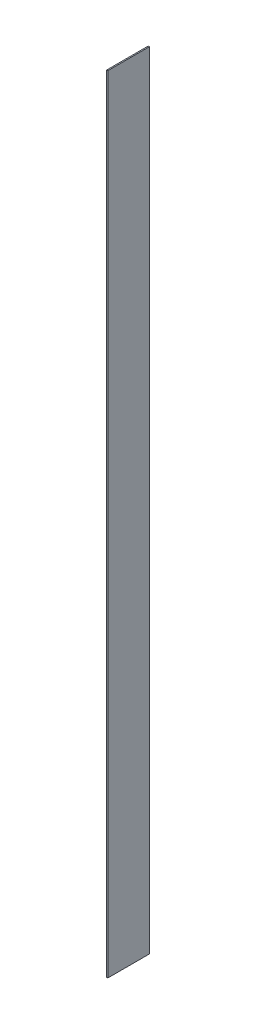
ISO-10303-21;
HEADER;
FILE_DESCRIPTION(('STEP AP214'),'2;1');
FILE_NAME('part.step','',(''),(''),'','','');
FILE_SCHEMA(('AUTOMOTIVE_DESIGN { 1 0 10303 214 1 1 1 1 }'));
ENDSEC;
DATA;
#1=APPLICATION_CONTEXT('core data for automotive mechanical design processes');
#2=APPLICATION_PROTOCOL_DEFINITION('international standard','automotive_design',2000,#1);
#3=PRODUCT_CONTEXT('',#1,'mechanical');
#4=PRODUCT('Part','Part','',(#3));
#5=PRODUCT_RELATED_PRODUCT_CATEGORY('part','',(#4));
#6=PRODUCT_DEFINITION_FORMATION('','',#4);
#7=PRODUCT_DEFINITION_CONTEXT('part definition',#1,'design');
#8=PRODUCT_DEFINITION('design','',#6,#7);
#9=PRODUCT_DEFINITION_SHAPE('','',#8);
#10=(LENGTH_UNIT() NAMED_UNIT(*) SI_UNIT(.MILLI.,.METRE.));
#11=(NAMED_UNIT(*) PLANE_ANGLE_UNIT() SI_UNIT($,.RADIAN.));
#12=(NAMED_UNIT(*) SI_UNIT($,.STERADIAN.) SOLID_ANGLE_UNIT());
#13=UNCERTAINTY_MEASURE_WITH_UNIT(LENGTH_MEASURE(1.E-05),#10,'distance_accuracy_value','');
#14=(GEOMETRIC_REPRESENTATION_CONTEXT(3) GLOBAL_UNCERTAINTY_ASSIGNED_CONTEXT((#13)) GLOBAL_UNIT_ASSIGNED_CONTEXT((#10,
#11,#12)) REPRESENTATION_CONTEXT('',''));
#15=CARTESIAN_POINT('',(0.,0.,0.));
#16=DIRECTION('',(0.,0.,1.));
#17=DIRECTION('',(1.,0.,0.));
#18=AXIS2_PLACEMENT_3D('',#15,#16,#17);
#19=CARTESIAN_POINT('',(19.84375,1600.2,18.3308031687094));
#20=DIRECTION('',(0.,1.,0.));
#21=DIRECTION('',(1.,0.,0.));
#22=AXIS2_PLACEMENT_3D('',#19,#20,#21);
#23=PLANE('',#22);
#24=DIRECTION('',(0.,0.,1.));
#25=VECTOR('',#24,1.);
#26=CARTESIAN_POINT('',(25.4,1600.2,15.9495531687094));
#27=LINE('',#26,#25);
#28=CARTESIAN_POINT('',(25.4,1600.2,-30.5954545454546));
#29=VERTEX_POINT('',#28);
#30=CARTESIAN_POINT('',(25.4,1600.2,54.0495531687094));
#31=VERTEX_POINT('',#30);
#32=EDGE_CURVE('E100',#29,#31,#27,.T.);
#33=ORIENTED_EDGE('',*,*,#32,.F.);
#34=DIRECTION('',(1.,0.,0.));
#35=VECTOR('',#34,1.);
#36=CARTESIAN_POINT('',(23.01875,1600.2,-30.5954545454546));
#37=LINE('',#36,#35);
#38=CARTESIAN_POINT('',(23.01875,1600.2,-30.5954545454546));
#39=VERTEX_POINT('',#38);
#40=EDGE_CURVE('E96',#39,#29,#37,.T.);
#41=ORIENTED_EDGE('',*,*,#40,.F.);
#42=DIRECTION('',(0.,0.,1.));
#43=VECTOR('',#42,1.);
#44=CARTESIAN_POINT('',(23.01875,1600.2,15.9495531687094));
#45=LINE('',#44,#43);
#46=CARTESIAN_POINT('',(23.01875,1600.2,54.0495531687094));
#47=VERTEX_POINT('',#46);
#48=EDGE_CURVE('E82',#39,#47,#45,.T.);
#49=ORIENTED_EDGE('',*,*,#48,.T.);
#50=DIRECTION('',(-1.,0.,0.));
#51=VECTOR('',#50,1.);
#52=CARTESIAN_POINT('',(25.4,1600.2,54.0495531687094));
#53=LINE('',#52,#51);
#54=EDGE_CURVE('E89',#31,#47,#53,.T.);
#55=ORIENTED_EDGE('',*,*,#54,.F.);
#56=EDGE_LOOP('',(#33,#41,#49,#55));
#57=FACE_BOUND('',#56,.T.);
#58=ADVANCED_FACE('F41',(#57),#23,.T.);
#59=CARTESIAN_POINT('',(23.01875,1600.2,15.9495531687094));
#60=DIRECTION('',(1.,0.,0.));
#61=DIRECTION('',(0.,0.,-1.));
#62=AXIS2_PLACEMENT_3D('',#59,#60,#61);
#63=PLANE('',#62);
#64=DIRECTION('',(0.,0.,1.));
#65=VECTOR('',#64,1.);
#66=CARTESIAN_POINT('',(23.01875,0.,15.9495531687094));
#67=LINE('',#66,#65);
#68=CARTESIAN_POINT('',(23.01875,0.,-30.5954545454546));
#69=VERTEX_POINT('',#68);
#70=CARTESIAN_POINT('',(23.01875,0.,54.0495531687094));
#71=VERTEX_POINT('',#70);
#72=EDGE_CURVE('E72',#69,#71,#67,.T.);
#73=ORIENTED_EDGE('',*,*,#72,.T.);
#74=DIRECTION('',(0.,-1.,0.));
#75=VECTOR('',#74,1.);
#76=CARTESIAN_POINT('',(23.01875,1600.2,54.0495531687094));
#77=LINE('',#76,#75);
#78=EDGE_CURVE('E12',#47,#71,#77,.T.);
#79=ORIENTED_EDGE('',*,*,#78,.F.);
#80=ORIENTED_EDGE('',*,*,#48,.F.);
#81=DIRECTION('',(0.,-1.,0.));
#82=VECTOR('',#81,1.);
#83=CARTESIAN_POINT('',(23.01875,1600.2,-30.5954545454546));
#84=LINE('',#83,#82);
#85=EDGE_CURVE('E85',#39,#69,#84,.T.);
#86=ORIENTED_EDGE('',*,*,#85,.T.);
#87=EDGE_LOOP('',(#73,#79,#80,#86));
#88=FACE_BOUND('',#87,.T.);
#89=ADVANCED_FACE('F84',(#88),#63,.F.);
#90=CARTESIAN_POINT('',(25.4,1600.2,54.0495531687094));
#91=DIRECTION('',(0.,0.,1.));
#92=DIRECTION('',(1.,0.,0.));
#93=AXIS2_PLACEMENT_3D('',#90,#91,#92);
#94=PLANE('',#93);
#95=DIRECTION('',(-1.,0.,0.));
#96=VECTOR('',#95,1.);
#97=CARTESIAN_POINT('',(25.4,0.,54.0495531687094));
#98=LINE('',#97,#96);
#99=CARTESIAN_POINT('',(25.4,0.,54.0495531687094));
#100=VERTEX_POINT('',#99);
#101=EDGE_CURVE('E110',#100,#71,#98,.T.);
#102=ORIENTED_EDGE('',*,*,#101,.F.);
#103=DIRECTION('',(0.,-1.,0.));
#104=VECTOR('',#103,1.);
#105=CARTESIAN_POINT('',(25.4,1600.2,54.0495531687094));
#106=LINE('',#105,#104);
#107=EDGE_CURVE('E50',#31,#100,#106,.T.);
#108=ORIENTED_EDGE('',*,*,#107,.F.);
#109=ORIENTED_EDGE('',*,*,#54,.T.);
#110=ORIENTED_EDGE('',*,*,#78,.T.);
#111=EDGE_LOOP('',(#102,#108,#109,#110));
#112=FACE_BOUND('',#111,.T.);
#113=ADVANCED_FACE('F114',(#112),#94,.T.);
#114=CARTESIAN_POINT('',(25.4,1600.2,-30.5954545454546));
#115=DIRECTION('',(1.,0.,0.));
#116=DIRECTION('',(0.,0.,-1.));
#117=AXIS2_PLACEMENT_3D('',#114,#115,#116);
#118=PLANE('',#117);
#119=DIRECTION('',(0.,0.,1.));
#120=VECTOR('',#119,1.);
#121=CARTESIAN_POINT('',(25.4,0.,15.9495531687094));
#122=LINE('',#121,#120);
#123=CARTESIAN_POINT('',(25.4,0.,-30.5954545454546));
#124=VERTEX_POINT('',#123);
#125=EDGE_CURVE('E90',#124,#100,#122,.T.);
#126=ORIENTED_EDGE('',*,*,#125,.F.);
#127=DIRECTION('',(0.,-1.,0.));
#128=VECTOR('',#127,1.);
#129=CARTESIAN_POINT('',(25.4,1600.2,-30.5954545454546));
#130=LINE('',#129,#128);
#131=EDGE_CURVE('E102',#29,#124,#130,.T.);
#132=ORIENTED_EDGE('',*,*,#131,.F.);
#133=ORIENTED_EDGE('',*,*,#32,.T.);
#134=ORIENTED_EDGE('',*,*,#107,.T.);
#135=EDGE_LOOP('',(#126,#132,#133,#134));
#136=FACE_BOUND('',#135,.T.);
#137=ADVANCED_FACE('F43',(#136),#118,.T.);
#138=CARTESIAN_POINT('',(19.84375,0.,21.5058031687094));
#139=DIRECTION('',(0.,-1.,0.));
#140=DIRECTION('',(0.,0.,1.));
#141=AXIS2_PLACEMENT_3D('',#138,#139,#140);
#142=PLANE('',#141);
#143=ORIENTED_EDGE('',*,*,#72,.F.);
#144=DIRECTION('',(1.,0.,0.));
#145=VECTOR('',#144,1.);
#146=CARTESIAN_POINT('',(23.01875,0.,-30.5954545454546));
#147=LINE('',#146,#145);
#148=EDGE_CURVE('E97',#69,#124,#147,.T.);
#149=ORIENTED_EDGE('',*,*,#148,.T.);
#150=ORIENTED_EDGE('',*,*,#125,.T.);
#151=ORIENTED_EDGE('',*,*,#101,.T.);
#152=EDGE_LOOP('',(#143,#149,#150,#151));
#153=FACE_BOUND('',#152,.T.);
#154=ADVANCED_FACE('F115',(#153),#142,.T.);
#155=CARTESIAN_POINT('',(23.01875,1600.2,-30.5954545454546));
#156=DIRECTION('',(0.,0.,-1.));
#157=DIRECTION('',(-1.,0.,0.));
#158=AXIS2_PLACEMENT_3D('',#155,#156,#157);
#159=PLANE('',#158);
#160=ORIENTED_EDGE('',*,*,#148,.F.);
#161=ORIENTED_EDGE('',*,*,#85,.F.);
#162=ORIENTED_EDGE('',*,*,#40,.T.);
#163=ORIENTED_EDGE('',*,*,#131,.T.);
#164=EDGE_LOOP('',(#160,#161,#162,#163));
#165=FACE_BOUND('',#164,.T.);
#166=ADVANCED_FACE('F94',(#165),#159,.T.);
#167=CLOSED_SHELL('',(#58,#89,#113,#137,#154,#166));
#168=MANIFOLD_SOLID_BREP('B2',#167);
#169=ADVANCED_BREP_SHAPE_REPRESENTATION('',(#18,#168),#14);
#170=SHAPE_DEFINITION_REPRESENTATION(#9,#169);
ENDSEC;
END-ISO-10303-21;
